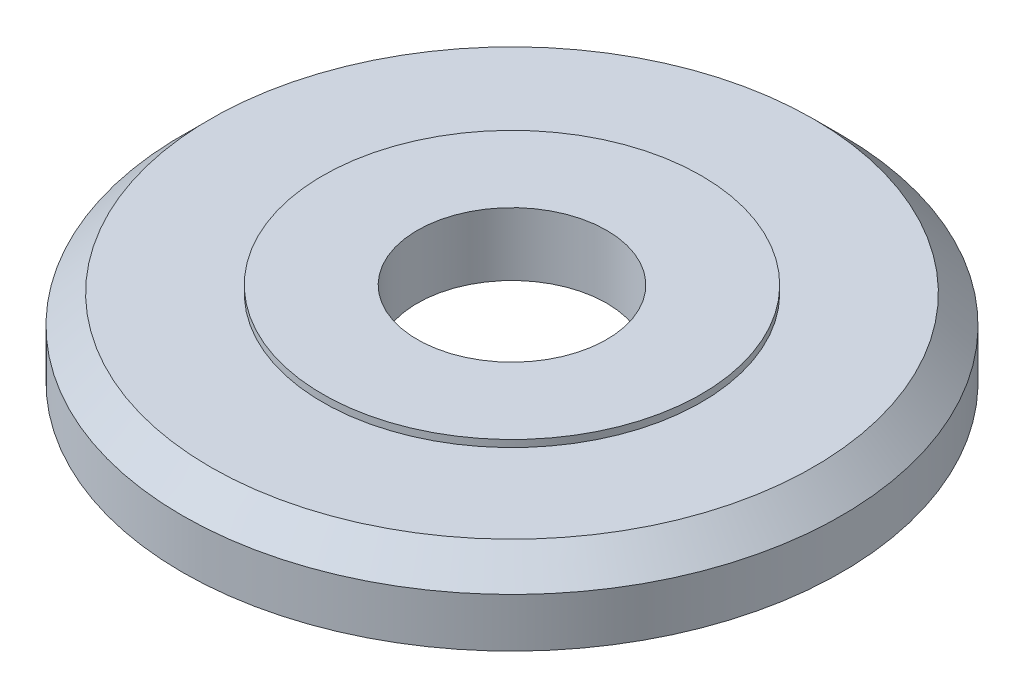
ISO-10303-21;
HEADER;
FILE_DESCRIPTION(('STEP AP214'),'2;1');
FILE_NAME('part.step','',(''),(''),'','','');
FILE_SCHEMA(('AUTOMOTIVE_DESIGN { 1 0 10303 214 1 1 1 1 }'));
ENDSEC;
DATA;
#1=APPLICATION_CONTEXT('core data for automotive mechanical design processes');
#2=APPLICATION_PROTOCOL_DEFINITION('international standard','automotive_design',2000,#1);
#3=PRODUCT_CONTEXT('',#1,'mechanical');
#4=PRODUCT('Part','Part','',(#3));
#5=PRODUCT_RELATED_PRODUCT_CATEGORY('part','',(#4));
#6=PRODUCT_DEFINITION_FORMATION('','',#4);
#7=PRODUCT_DEFINITION_CONTEXT('part definition',#1,'design');
#8=PRODUCT_DEFINITION('design','',#6,#7);
#9=PRODUCT_DEFINITION_SHAPE('','',#8);
#10=(LENGTH_UNIT() NAMED_UNIT(*) SI_UNIT(.MILLI.,.METRE.));
#11=(NAMED_UNIT(*) PLANE_ANGLE_UNIT() SI_UNIT($,.RADIAN.));
#12=(NAMED_UNIT(*) SI_UNIT($,.STERADIAN.) SOLID_ANGLE_UNIT());
#13=UNCERTAINTY_MEASURE_WITH_UNIT(LENGTH_MEASURE(1.E-05),#10,'distance_accuracy_value','');
#14=(GEOMETRIC_REPRESENTATION_CONTEXT(3) GLOBAL_UNCERTAINTY_ASSIGNED_CONTEXT((#13)) GLOBAL_UNIT_ASSIGNED_CONTEXT((#10,
#11,#12)) REPRESENTATION_CONTEXT('',''));
#15=CARTESIAN_POINT('',(0.,0.,0.));
#16=DIRECTION('',(0.,0.,1.));
#17=DIRECTION('',(1.,0.,0.));
#18=AXIS2_PLACEMENT_3D('',#15,#16,#17);
#19=CARTESIAN_POINT('',(13.5,0.,0.));
#20=DIRECTION('',(0.,-1.,0.));
#21=DIRECTION('',(0.,0.,-1.));
#22=AXIS2_PLACEMENT_3D('',#19,#20,#21);
#23=PLANE('',#22);
#24=CARTESIAN_POINT('',(0.,0.,0.));
#25=DIRECTION('',(0.,-1.,0.));
#26=DIRECTION('',(0.,0.,-1.));
#27=AXIS2_PLACEMENT_3D('',#24,#25,#26);
#28=CIRCLE('',#27,36.);
#29=CARTESIAN_POINT('',(0.,0.,-36.));
#30=VERTEX_POINT('',#29);
#31=EDGE_CURVE('E10',#30,#30,#28,.T.);
#32=ORIENTED_EDGE('',*,*,#31,.T.);
#33=EDGE_LOOP('',(#32));
#34=FACE_BOUND('',#33,.T.);
#35=CARTESIAN_POINT('',(0.,0.,0.));
#36=DIRECTION('',(0.,-1.,0.));
#37=DIRECTION('',(0.,0.,-1.));
#38=AXIS2_PLACEMENT_3D('',#35,#36,#37);
#39=CIRCLE('',#38,13.5);
#40=CARTESIAN_POINT('',(0.,0.,-13.5));
#41=VERTEX_POINT('',#40);
#42=EDGE_CURVE('E73',#41,#41,#39,.T.);
#43=ORIENTED_EDGE('',*,*,#42,.F.);
#44=EDGE_LOOP('',(#43));
#45=FACE_BOUND('',#44,.T.);
#46=ADVANCED_FACE('F30',(#34,#45),#23,.T.);
#47=CARTESIAN_POINT('',(0.,0.,0.));
#48=DIRECTION('',(0.,-1.,0.));
#49=DIRECTION('',(0.,0.,-1.));
#50=AXIS2_PLACEMENT_3D('',#47,#48,#49);
#51=CONICAL_SURFACE('',#50,36.,0.463647609000806);
#52=CARTESIAN_POINT('',(0.,-2.,0.));
#53=DIRECTION('',(0.,-1.,0.));
#54=DIRECTION('',(0.,0.,-1.));
#55=AXIS2_PLACEMENT_3D('',#52,#53,#54);
#56=CIRCLE('',#55,37.);
#57=CARTESIAN_POINT('',(0.,-2.,-37.));
#58=VERTEX_POINT('',#57);
#59=EDGE_CURVE('E36',#58,#58,#56,.T.);
#60=ORIENTED_EDGE('',*,*,#59,.T.);
#61=EDGE_LOOP('',(#60));
#62=FACE_BOUND('',#61,.T.);
#63=ORIENTED_EDGE('',*,*,#31,.F.);
#64=EDGE_LOOP('',(#63));
#65=FACE_BOUND('',#64,.T.);
#66=ADVANCED_FACE('F81',(#62,#65),#51,.F.);
#67=CARTESIAN_POINT('',(37.,-2.,0.));
#68=DIRECTION('',(0.,-1.,0.));
#69=DIRECTION('',(0.,0.,-1.));
#70=AXIS2_PLACEMENT_3D('',#67,#68,#69);
#71=PLANE('',#70);
#72=CARTESIAN_POINT('',(0.,-2.,0.));
#73=DIRECTION('',(0.,-1.,0.));
#74=DIRECTION('',(0.,0.,-1.));
#75=AXIS2_PLACEMENT_3D('',#72,#73,#74);
#76=CIRCLE('',#75,39.);
#77=CARTESIAN_POINT('',(0.,-2.,-39.));
#78=VERTEX_POINT('',#77);
#79=EDGE_CURVE('E40',#78,#78,#76,.T.);
#80=ORIENTED_EDGE('',*,*,#79,.T.);
#81=EDGE_LOOP('',(#80));
#82=FACE_BOUND('',#81,.T.);
#83=ORIENTED_EDGE('',*,*,#59,.F.);
#84=EDGE_LOOP('',(#83));
#85=FACE_BOUND('',#84,.T.);
#86=ADVANCED_FACE('F85',(#82,#85),#71,.T.);
#87=CARTESIAN_POINT('',(0.,3.39702797202797,0.));
#88=DIRECTION('',(0.,-1.,0.));
#89=DIRECTION('',(0.,0.,-1.));
#90=AXIS2_PLACEMENT_3D('',#87,#88,#89);
#91=CYLINDRICAL_SURFACE('',#90,39.);
#92=CARTESIAN_POINT('',(0.,1.,0.));
#93=DIRECTION('',(0.,-1.,0.));
#94=DIRECTION('',(0.,0.,-1.));
#95=AXIS2_PLACEMENT_3D('',#92,#93,#94);
#96=CIRCLE('',#95,39.);
#97=CARTESIAN_POINT('',(0.,1.,-39.));
#98=VERTEX_POINT('',#97);
#99=EDGE_CURVE('E44',#98,#98,#96,.T.);
#100=ORIENTED_EDGE('',*,*,#99,.T.);
#101=EDGE_LOOP('',(#100));
#102=FACE_BOUND('',#101,.T.);
#103=ORIENTED_EDGE('',*,*,#79,.F.);
#104=EDGE_LOOP('',(#103));
#105=FACE_BOUND('',#104,.T.);
#106=ADVANCED_FACE('F89',(#102,#105),#91,.T.);
#107=CARTESIAN_POINT('',(39.,1.,0.));
#108=DIRECTION('',(0.,-1.,0.));
#109=DIRECTION('',(0.,0.,-1.));
#110=AXIS2_PLACEMENT_3D('',#107,#108,#109);
#111=PLANE('',#110);
#112=CARTESIAN_POINT('',(0.,1.,0.));
#113=DIRECTION('',(0.,-1.,0.));
#114=DIRECTION('',(0.,0.,-1.));
#115=AXIS2_PLACEMENT_3D('',#112,#113,#114);
#116=CIRCLE('',#115,45.);
#117=CARTESIAN_POINT('',(0.,1.,-45.));
#118=VERTEX_POINT('',#117);
#119=EDGE_CURVE('E49',#118,#118,#116,.T.);
#120=ORIENTED_EDGE('',*,*,#119,.T.);
#121=EDGE_LOOP('',(#120));
#122=FACE_BOUND('',#121,.T.);
#123=ORIENTED_EDGE('',*,*,#99,.F.);
#124=EDGE_LOOP('',(#123));
#125=FACE_BOUND('',#124,.T.);
#126=ADVANCED_FACE('F96',(#122,#125),#111,.T.);
#127=CARTESIAN_POINT('',(0.,3.39702797202797,0.));
#128=DIRECTION('',(0.,-1.,0.));
#129=DIRECTION('',(0.,0.,-1.));
#130=AXIS2_PLACEMENT_3D('',#127,#128,#129);
#131=CYLINDRICAL_SURFACE('',#130,45.);
#132=CARTESIAN_POINT('',(0.,-3.,0.));
#133=DIRECTION('',(0.,-1.,0.));
#134=DIRECTION('',(0.,0.,-1.));
#135=AXIS2_PLACEMENT_3D('',#132,#133,#134);
#136=CIRCLE('',#135,45.);
#137=CARTESIAN_POINT('',(0.,-3.,-45.));
#138=VERTEX_POINT('',#137);
#139=EDGE_CURVE('E52',#138,#138,#136,.T.);
#140=ORIENTED_EDGE('',*,*,#139,.T.);
#141=EDGE_LOOP('',(#140));
#142=FACE_BOUND('',#141,.T.);
#143=ORIENTED_EDGE('',*,*,#119,.F.);
#144=EDGE_LOOP('',(#143));
#145=FACE_BOUND('',#144,.T.);
#146=ADVANCED_FACE('F100',(#142,#145),#131,.F.);
#147=CARTESIAN_POINT('',(45.,-3.,0.));
#148=DIRECTION('',(0.,-1.,0.));
#149=DIRECTION('',(0.,0.,-1.));
#150=AXIS2_PLACEMENT_3D('',#147,#148,#149);
#151=PLANE('',#150);
#152=CARTESIAN_POINT('',(0.,-3.,0.));
#153=DIRECTION('',(0.,-1.,0.));
#154=DIRECTION('',(0.,0.,-1.));
#155=AXIS2_PLACEMENT_3D('',#152,#153,#154);
#156=CIRCLE('',#155,47.);
#157=CARTESIAN_POINT('',(0.,-3.,-47.));
#158=VERTEX_POINT('',#157);
#159=EDGE_CURVE('E55',#158,#158,#156,.T.);
#160=ORIENTED_EDGE('',*,*,#159,.T.);
#161=EDGE_LOOP('',(#160));
#162=FACE_BOUND('',#161,.T.);
#163=ORIENTED_EDGE('',*,*,#139,.F.);
#164=EDGE_LOOP('',(#163));
#165=FACE_BOUND('',#164,.T.);
#166=ADVANCED_FACE('F104',(#162,#165),#151,.T.);
#167=CARTESIAN_POINT('',(0.,3.39702797202797,0.));
#168=DIRECTION('',(0.,-1.,0.));
#169=DIRECTION('',(0.,0.,-1.));
#170=AXIS2_PLACEMENT_3D('',#167,#168,#169);
#171=CYLINDRICAL_SURFACE('',#170,47.);
#172=CARTESIAN_POINT('',(0.,4.,0.));
#173=DIRECTION('',(0.,-1.,0.));
#174=DIRECTION('',(0.,0.,-1.));
#175=AXIS2_PLACEMENT_3D('',#172,#173,#174);
#176=CIRCLE('',#175,47.);
#177=CARTESIAN_POINT('',(0.,4.,-47.));
#178=VERTEX_POINT('',#177);
#179=EDGE_CURVE('E58',#178,#178,#176,.T.);
#180=ORIENTED_EDGE('',*,*,#179,.T.);
#181=EDGE_LOOP('',(#180));
#182=FACE_BOUND('',#181,.T.);
#183=ORIENTED_EDGE('',*,*,#159,.F.);
#184=EDGE_LOOP('',(#183));
#185=FACE_BOUND('',#184,.T.);
#186=ADVANCED_FACE('F108',(#182,#185),#171,.T.);
#187=CARTESIAN_POINT('',(0.,4.,0.));
#188=DIRECTION('',(0.,-1.,0.));
#189=DIRECTION('',(0.,0.,-1.));
#190=AXIS2_PLACEMENT_3D('',#187,#188,#189);
#191=CONICAL_SURFACE('',#190,47.,0.785398163397449);
#192=CARTESIAN_POINT('',(0.,8.,0.));
#193=DIRECTION('',(0.,-1.,0.));
#194=DIRECTION('',(0.,0.,-1.));
#195=AXIS2_PLACEMENT_3D('',#192,#193,#194);
#196=CIRCLE('',#195,43.);
#197=CARTESIAN_POINT('',(0.,8.,-43.));
#198=VERTEX_POINT('',#197);
#199=EDGE_CURVE('E61',#198,#198,#196,.T.);
#200=ORIENTED_EDGE('',*,*,#199,.T.);
#201=EDGE_LOOP('',(#200));
#202=FACE_BOUND('',#201,.T.);
#203=ORIENTED_EDGE('',*,*,#179,.F.);
#204=EDGE_LOOP('',(#203));
#205=FACE_BOUND('',#204,.T.);
#206=ADVANCED_FACE('F112',(#202,#205),#191,.T.);
#207=CARTESIAN_POINT('',(43.,8.,0.));
#208=DIRECTION('',(0.,1.,0.));
#209=DIRECTION('',(0.,0.,1.));
#210=AXIS2_PLACEMENT_3D('',#207,#208,#209);
#211=PLANE('',#210);
#212=CARTESIAN_POINT('',(0.,8.,0.));
#213=DIRECTION('',(0.,-1.,0.));
#214=DIRECTION('',(0.,0.,-1.));
#215=AXIS2_PLACEMENT_3D('',#212,#213,#214);
#216=CIRCLE('',#215,27.);
#217=CARTESIAN_POINT('',(0.,8.,-27.));
#218=VERTEX_POINT('',#217);
#219=EDGE_CURVE('E64',#218,#218,#216,.T.);
#220=ORIENTED_EDGE('',*,*,#219,.T.);
#221=EDGE_LOOP('',(#220));
#222=FACE_BOUND('',#221,.T.);
#223=ORIENTED_EDGE('',*,*,#199,.F.);
#224=EDGE_LOOP('',(#223));
#225=FACE_BOUND('',#224,.T.);
#226=ADVANCED_FACE('F116',(#222,#225),#211,.T.);
#227=CARTESIAN_POINT('',(0.,3.39702797202797,0.));
#228=DIRECTION('',(0.,-1.,0.));
#229=DIRECTION('',(0.,0.,-1.));
#230=AXIS2_PLACEMENT_3D('',#227,#228,#229);
#231=CYLINDRICAL_SURFACE('',#230,27.);
#232=CARTESIAN_POINT('',(0.,9.,0.));
#233=DIRECTION('',(0.,-1.,0.));
#234=DIRECTION('',(0.,0.,-1.));
#235=AXIS2_PLACEMENT_3D('',#232,#233,#234);
#236=CIRCLE('',#235,27.);
#237=CARTESIAN_POINT('',(0.,9.,-27.));
#238=VERTEX_POINT('',#237);
#239=EDGE_CURVE('E67',#238,#238,#236,.T.);
#240=ORIENTED_EDGE('',*,*,#239,.T.);
#241=EDGE_LOOP('',(#240));
#242=FACE_BOUND('',#241,.T.);
#243=ORIENTED_EDGE('',*,*,#219,.F.);
#244=EDGE_LOOP('',(#243));
#245=FACE_BOUND('',#244,.T.);
#246=ADVANCED_FACE('F120',(#242,#245),#231,.T.);
#247=CARTESIAN_POINT('',(27.,9.,0.));
#248=DIRECTION('',(0.,1.,0.));
#249=DIRECTION('',(0.,0.,1.));
#250=AXIS2_PLACEMENT_3D('',#247,#248,#249);
#251=PLANE('',#250);
#252=CARTESIAN_POINT('',(0.,9.,0.));
#253=DIRECTION('',(0.,-1.,0.));
#254=DIRECTION('',(0.,0.,-1.));
#255=AXIS2_PLACEMENT_3D('',#252,#253,#254);
#256=CIRCLE('',#255,13.5);
#257=CARTESIAN_POINT('',(0.,9.,-13.5));
#258=VERTEX_POINT('',#257);
#259=EDGE_CURVE('E70',#258,#258,#256,.T.);
#260=ORIENTED_EDGE('',*,*,#259,.T.);
#261=EDGE_LOOP('',(#260));
#262=FACE_BOUND('',#261,.T.);
#263=ORIENTED_EDGE('',*,*,#239,.F.);
#264=EDGE_LOOP('',(#263));
#265=FACE_BOUND('',#264,.T.);
#266=ADVANCED_FACE('F124',(#262,#265),#251,.T.);
#267=CARTESIAN_POINT('',(0.,3.39702797202797,0.));
#268=DIRECTION('',(0.,-1.,0.));
#269=DIRECTION('',(0.,0.,-1.));
#270=AXIS2_PLACEMENT_3D('',#267,#268,#269);
#271=CYLINDRICAL_SURFACE('',#270,13.5);
#272=ORIENTED_EDGE('',*,*,#42,.T.);
#273=EDGE_LOOP('',(#272));
#274=FACE_BOUND('',#273,.T.);
#275=ORIENTED_EDGE('',*,*,#259,.F.);
#276=EDGE_LOOP('',(#275));
#277=FACE_BOUND('',#276,.T.);
#278=ADVANCED_FACE('F77',(#274,#277),#271,.F.);
#279=CLOSED_SHELL('',(#46,#66,#86,#106,#126,#146,#166,#186,#206,#226,#246,#266,#278));
#280=MANIFOLD_SOLID_BREP('B2',#279);
#281=ADVANCED_BREP_SHAPE_REPRESENTATION('',(#18,#280),#14);
#282=SHAPE_DEFINITION_REPRESENTATION(#9,#281);
ENDSEC;
END-ISO-10303-21;
